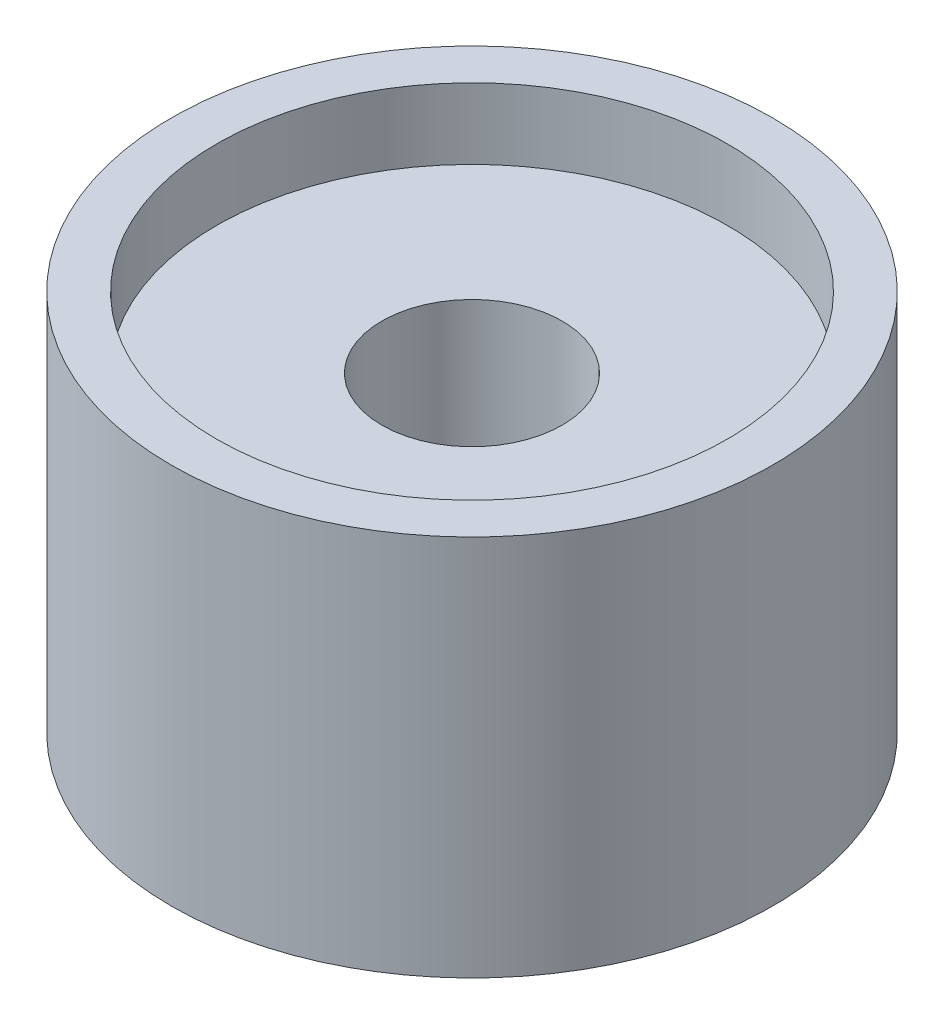
ISO-10303-21;
HEADER;
FILE_DESCRIPTION(('STEP AP214'),'2;1');
FILE_NAME('part.step','',(''),(''),'','','');
FILE_SCHEMA(('AUTOMOTIVE_DESIGN { 1 0 10303 214 1 1 1 1 }'));
ENDSEC;
DATA;
#1=APPLICATION_CONTEXT('core data for automotive mechanical design processes');
#2=APPLICATION_PROTOCOL_DEFINITION('international standard','automotive_design',2000,#1);
#3=PRODUCT_CONTEXT('',#1,'mechanical');
#4=PRODUCT('Part','Part','',(#3));
#5=PRODUCT_RELATED_PRODUCT_CATEGORY('part','',(#4));
#6=PRODUCT_DEFINITION_FORMATION('','',#4);
#7=PRODUCT_DEFINITION_CONTEXT('part definition',#1,'design');
#8=PRODUCT_DEFINITION('design','',#6,#7);
#9=PRODUCT_DEFINITION_SHAPE('','',#8);
#10=(LENGTH_UNIT() NAMED_UNIT(*) SI_UNIT(.MILLI.,.METRE.));
#11=(NAMED_UNIT(*) PLANE_ANGLE_UNIT() SI_UNIT($,.RADIAN.));
#12=(NAMED_UNIT(*) SI_UNIT($,.STERADIAN.) SOLID_ANGLE_UNIT());
#13=UNCERTAINTY_MEASURE_WITH_UNIT(LENGTH_MEASURE(1.E-05),#10,'distance_accuracy_value','');
#14=(GEOMETRIC_REPRESENTATION_CONTEXT(3) GLOBAL_UNCERTAINTY_ASSIGNED_CONTEXT((#13)) GLOBAL_UNIT_ASSIGNED_CONTEXT((#10,
#11,#12)) REPRESENTATION_CONTEXT('',''));
#15=CARTESIAN_POINT('',(0.,0.,0.));
#16=DIRECTION('',(0.,0.,1.));
#17=DIRECTION('',(1.,0.,0.));
#18=AXIS2_PLACEMENT_3D('',#15,#16,#17);
#19=CARTESIAN_POINT('',(0.,63.5,0.));
#20=DIRECTION('',(0.,-1.,0.));
#21=DIRECTION('',(0.,0.,-1.));
#22=AXIS2_PLACEMENT_3D('',#19,#20,#21);
#23=CYLINDRICAL_SURFACE('',#22,85.);
#24=CARTESIAN_POINT('',(0.,-63.5,0.));
#25=DIRECTION('',(0.,1.,0.));
#26=DIRECTION('',(0.,0.,1.));
#27=AXIS2_PLACEMENT_3D('',#24,#25,#26);
#28=CIRCLE('',#27,85.);
#29=CARTESIAN_POINT('',(0.,-63.5,85.));
#30=VERTEX_POINT('',#29);
#31=EDGE_CURVE('E49',#30,#30,#28,.T.);
#32=ORIENTED_EDGE('',*,*,#31,.F.);
#33=EDGE_LOOP('',(#32));
#34=FACE_BOUND('',#33,.T.);
#35=CARTESIAN_POINT('',(0.,-40.,0.));
#36=DIRECTION('',(0.,1.,0.));
#37=DIRECTION('',(0.,0.,1.));
#38=AXIS2_PLACEMENT_3D('',#35,#36,#37);
#39=CIRCLE('',#38,85.);
#40=CARTESIAN_POINT('',(0.,-40.,85.));
#41=VERTEX_POINT('',#40);
#42=EDGE_CURVE('E52',#41,#41,#39,.T.);
#43=ORIENTED_EDGE('',*,*,#42,.T.);
#44=EDGE_LOOP('',(#43));
#45=FACE_BOUND('',#44,.T.);
#46=ADVANCED_FACE('F31',(#34,#45),#23,.F.);
#47=CARTESIAN_POINT('',(0.,63.5,0.));
#48=DIRECTION('',(0.,1.,0.));
#49=DIRECTION('',(0.,0.,1.));
#50=AXIS2_PLACEMENT_3D('',#47,#48,#49);
#51=PLANE('',#50);
#52=CARTESIAN_POINT('',(0.,63.5,0.));
#53=DIRECTION('',(0.,1.,0.));
#54=DIRECTION('',(0.,0.,1.));
#55=AXIS2_PLACEMENT_3D('',#52,#53,#54);
#56=CIRCLE('',#55,100.);
#57=CARTESIAN_POINT('',(0.,63.5,100.));
#58=VERTEX_POINT('',#57);
#59=EDGE_CURVE('E38',#58,#58,#56,.T.);
#60=ORIENTED_EDGE('',*,*,#59,.T.);
#61=EDGE_LOOP('',(#60));
#62=FACE_BOUND('',#61,.T.);
#63=CARTESIAN_POINT('',(0.,63.5,0.));
#64=DIRECTION('',(0.,1.,0.));
#65=DIRECTION('',(0.,0.,1.));
#66=AXIS2_PLACEMENT_3D('',#63,#64,#65);
#67=CIRCLE('',#66,85.);
#68=CARTESIAN_POINT('',(0.,63.5,85.));
#69=VERTEX_POINT('',#68);
#70=EDGE_CURVE('E47',#69,#69,#67,.T.);
#71=ORIENTED_EDGE('',*,*,#70,.F.);
#72=EDGE_LOOP('',(#71));
#73=FACE_BOUND('',#72,.T.);
#74=ADVANCED_FACE('F82',(#62,#73),#51,.T.);
#75=CARTESIAN_POINT('',(0.,-63.5,0.));
#76=DIRECTION('',(0.,1.,0.));
#77=DIRECTION('',(0.,0.,1.));
#78=AXIS2_PLACEMENT_3D('',#75,#76,#77);
#79=PLANE('',#78);
#80=CARTESIAN_POINT('',(0.,-63.5,0.));
#81=DIRECTION('',(0.,1.,0.));
#82=DIRECTION('',(0.,0.,1.));
#83=AXIS2_PLACEMENT_3D('',#80,#81,#82);
#84=CIRCLE('',#83,100.);
#85=CARTESIAN_POINT('',(0.,-63.5,100.));
#86=VERTEX_POINT('',#85);
#87=EDGE_CURVE('E42',#86,#86,#84,.T.);
#88=ORIENTED_EDGE('',*,*,#87,.F.);
#89=EDGE_LOOP('',(#88));
#90=FACE_BOUND('',#89,.T.);
#91=ORIENTED_EDGE('',*,*,#31,.T.);
#92=EDGE_LOOP('',(#91));
#93=FACE_BOUND('',#92,.T.);
#94=ADVANCED_FACE('F87',(#90,#93),#79,.F.);
#95=CARTESIAN_POINT('',(0.,63.5,0.));
#96=DIRECTION('',(0.,-1.,0.));
#97=DIRECTION('',(0.,0.,-1.));
#98=AXIS2_PLACEMENT_3D('',#95,#96,#97);
#99=CYLINDRICAL_SURFACE('',#98,100.);
#100=ORIENTED_EDGE('',*,*,#59,.F.);
#101=EDGE_LOOP('',(#100));
#102=FACE_BOUND('',#101,.T.);
#103=ORIENTED_EDGE('',*,*,#87,.T.);
#104=EDGE_LOOP('',(#103));
#105=FACE_BOUND('',#104,.T.);
#106=ADVANCED_FACE('F33',(#102,#105),#99,.T.);
#107=CARTESIAN_POINT('',(0.,40.,0.));
#108=DIRECTION('',(0.,1.,0.));
#109=DIRECTION('',(0.,0.,1.));
#110=AXIS2_PLACEMENT_3D('',#107,#108,#109);
#111=CIRCLE('',#110,85.);
#112=CARTESIAN_POINT('',(0.,40.,85.));
#113=VERTEX_POINT('',#112);
#114=EDGE_CURVE('E10',#113,#113,#111,.T.);
#115=ORIENTED_EDGE('',*,*,#114,.F.);
#116=EDGE_LOOP('',(#115));
#117=FACE_BOUND('',#116,.T.);
#118=ORIENTED_EDGE('',*,*,#70,.T.);
#119=EDGE_LOOP('',(#118));
#120=FACE_BOUND('',#119,.T.);
#121=ADVANCED_FACE('F70',(#117,#120),#23,.F.);
#122=CARTESIAN_POINT('',(0.,40.,0.));
#123=DIRECTION('',(0.,1.,0.));
#124=DIRECTION('',(0.,0.,1.));
#125=AXIS2_PLACEMENT_3D('',#122,#123,#124);
#126=PLANE('',#125);
#127=ORIENTED_EDGE('',*,*,#114,.T.);
#128=EDGE_LOOP('',(#127));
#129=FACE_BOUND('',#128,.T.);
#130=CARTESIAN_POINT('',(0.,40.,0.));
#131=DIRECTION('',(0.,1.,0.));
#132=DIRECTION('',(0.,0.,1.));
#133=AXIS2_PLACEMENT_3D('',#130,#131,#132);
#134=CIRCLE('',#133,30.);
#135=CARTESIAN_POINT('',(0.,40.,30.));
#136=VERTEX_POINT('',#135);
#137=EDGE_CURVE('E57',#136,#136,#134,.T.);
#138=ORIENTED_EDGE('',*,*,#137,.F.);
#139=EDGE_LOOP('',(#138));
#140=FACE_BOUND('',#139,.T.);
#141=ADVANCED_FACE('F67',(#129,#140),#126,.T.);
#142=CARTESIAN_POINT('',(0.,-40.,0.));
#143=DIRECTION('',(0.,1.,0.));
#144=DIRECTION('',(0.,0.,1.));
#145=AXIS2_PLACEMENT_3D('',#142,#143,#144);
#146=PLANE('',#145);
#147=ORIENTED_EDGE('',*,*,#42,.F.);
#148=EDGE_LOOP('',(#147));
#149=FACE_BOUND('',#148,.T.);
#150=CARTESIAN_POINT('',(0.,-40.,0.));
#151=DIRECTION('',(0.,1.,0.));
#152=DIRECTION('',(0.,0.,1.));
#153=AXIS2_PLACEMENT_3D('',#150,#151,#152);
#154=CIRCLE('',#153,30.);
#155=CARTESIAN_POINT('',(0.,-40.,30.));
#156=VERTEX_POINT('',#155);
#157=EDGE_CURVE('E58',#156,#156,#154,.T.);
#158=ORIENTED_EDGE('',*,*,#157,.T.);
#159=EDGE_LOOP('',(#158));
#160=FACE_BOUND('',#159,.T.);
#161=ADVANCED_FACE('F69',(#149,#160),#146,.F.);
#162=CARTESIAN_POINT('',(0.,40.,0.));
#163=DIRECTION('',(0.,-1.,0.));
#164=DIRECTION('',(0.,0.,-1.));
#165=AXIS2_PLACEMENT_3D('',#162,#163,#164);
#166=CYLINDRICAL_SURFACE('',#165,30.);
#167=ORIENTED_EDGE('',*,*,#137,.T.);
#168=EDGE_LOOP('',(#167));
#169=FACE_BOUND('',#168,.T.);
#170=ORIENTED_EDGE('',*,*,#157,.F.);
#171=EDGE_LOOP('',(#170));
#172=FACE_BOUND('',#171,.T.);
#173=ADVANCED_FACE('F64',(#169,#172),#166,.F.);
#174=CLOSED_SHELL('',(#46,#74,#94,#106,#121,#141,#161,#173));
#175=MANIFOLD_SOLID_BREP('B2',#174);
#176=ADVANCED_BREP_SHAPE_REPRESENTATION('',(#18,#175),#14);
#177=SHAPE_DEFINITION_REPRESENTATION(#9,#176);
ENDSEC;
END-ISO-10303-21;
